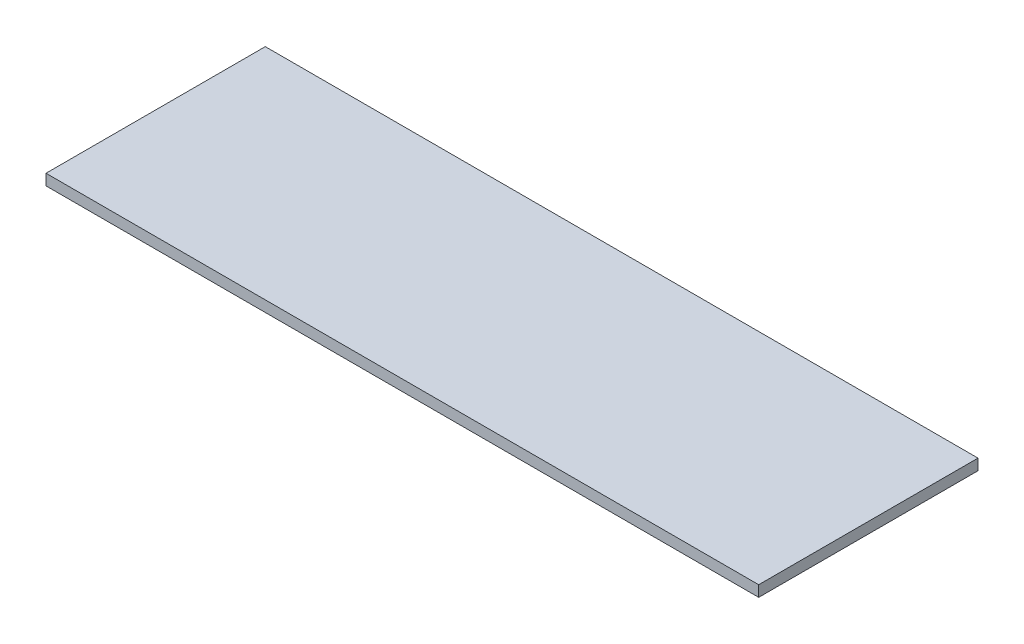
ISO-10303-21;
HEADER;
FILE_DESCRIPTION(('STEP AP214'),'2;1');
FILE_NAME('part.step','',(''),(''),'','','');
FILE_SCHEMA(('AUTOMOTIVE_DESIGN { 1 0 10303 214 1 1 1 1 }'));
ENDSEC;
DATA;
#1=APPLICATION_CONTEXT('core data for automotive mechanical design processes');
#2=APPLICATION_PROTOCOL_DEFINITION('international standard','automotive_design',2000,#1);
#3=PRODUCT_CONTEXT('',#1,'mechanical');
#4=PRODUCT('Part','Part','',(#3));
#5=PRODUCT_RELATED_PRODUCT_CATEGORY('part','',(#4));
#6=PRODUCT_DEFINITION_FORMATION('','',#4);
#7=PRODUCT_DEFINITION_CONTEXT('part definition',#1,'design');
#8=PRODUCT_DEFINITION('design','',#6,#7);
#9=PRODUCT_DEFINITION_SHAPE('','',#8);
#10=(LENGTH_UNIT() NAMED_UNIT(*) SI_UNIT(.MILLI.,.METRE.));
#11=(NAMED_UNIT(*) PLANE_ANGLE_UNIT() SI_UNIT($,.RADIAN.));
#12=(NAMED_UNIT(*) SI_UNIT($,.STERADIAN.) SOLID_ANGLE_UNIT());
#13=UNCERTAINTY_MEASURE_WITH_UNIT(LENGTH_MEASURE(1.E-05),#10,'distance_accuracy_value','');
#14=(GEOMETRIC_REPRESENTATION_CONTEXT(3) GLOBAL_UNCERTAINTY_ASSIGNED_CONTEXT((#13)) GLOBAL_UNIT_ASSIGNED_CONTEXT((#10,
#11,#12)) REPRESENTATION_CONTEXT('',''));
#15=CARTESIAN_POINT('',(0.,0.,0.));
#16=DIRECTION('',(0.,0.,1.));
#17=DIRECTION('',(1.,0.,0.));
#18=AXIS2_PLACEMENT_3D('',#15,#16,#17);
#19=CARTESIAN_POINT('',(585.,18.,-180.));
#20=DIRECTION('',(-1.,0.,0.));
#21=DIRECTION('',(0.,0.,1.));
#22=AXIS2_PLACEMENT_3D('',#19,#20,#21);
#23=PLANE('',#22);
#24=DIRECTION('',(0.,0.,-1.));
#25=VECTOR('',#24,1.);
#26=CARTESIAN_POINT('',(585.,0.,-180.));
#27=LINE('',#26,#25);
#28=CARTESIAN_POINT('',(585.,0.,180.));
#29=VERTEX_POINT('',#28);
#30=CARTESIAN_POINT('',(585.,0.,-180.));
#31=VERTEX_POINT('',#30);
#32=EDGE_CURVE('E96',#29,#31,#27,.T.);
#33=ORIENTED_EDGE('',*,*,#32,.T.);
#34=DIRECTION('',(0.,-1.,0.));
#35=VECTOR('',#34,1.);
#36=CARTESIAN_POINT('',(585.,18.,-180.));
#37=LINE('',#36,#35);
#38=CARTESIAN_POINT('',(585.,18.,-180.));
#39=VERTEX_POINT('',#38);
#40=EDGE_CURVE('E11',#39,#31,#37,.T.);
#41=ORIENTED_EDGE('',*,*,#40,.F.);
#42=DIRECTION('',(0.,0.,-1.));
#43=VECTOR('',#42,1.);
#44=CARTESIAN_POINT('',(585.,18.,-180.));
#45=LINE('',#44,#43);
#46=CARTESIAN_POINT('',(585.,18.,180.));
#47=VERTEX_POINT('',#46);
#48=EDGE_CURVE('E84',#47,#39,#45,.T.);
#49=ORIENTED_EDGE('',*,*,#48,.F.);
#50=DIRECTION('',(0.,-1.,0.));
#51=VECTOR('',#50,1.);
#52=CARTESIAN_POINT('',(585.,18.,180.));
#53=LINE('',#52,#51);
#54=EDGE_CURVE('E92',#47,#29,#53,.T.);
#55=ORIENTED_EDGE('',*,*,#54,.T.);
#56=EDGE_LOOP('',(#33,#41,#49,#55));
#57=FACE_BOUND('',#56,.T.);
#58=ADVANCED_FACE('F33',(#57),#23,.F.);
#59=CARTESIAN_POINT('',(-585.,18.,-180.));
#60=DIRECTION('',(0.,0.,1.));
#61=DIRECTION('',(1.,0.,0.));
#62=AXIS2_PLACEMENT_3D('',#59,#60,#61);
#63=PLANE('',#62);
#64=DIRECTION('',(-1.,0.,0.));
#65=VECTOR('',#64,1.);
#66=CARTESIAN_POINT('',(-585.,0.,-180.));
#67=LINE('',#66,#65);
#68=CARTESIAN_POINT('',(-585.,0.,-180.));
#69=VERTEX_POINT('',#68);
#70=EDGE_CURVE('E88',#31,#69,#67,.T.);
#71=ORIENTED_EDGE('',*,*,#70,.T.);
#72=DIRECTION('',(0.,-1.,0.));
#73=VECTOR('',#72,1.);
#74=CARTESIAN_POINT('',(-585.,18.,-180.));
#75=LINE('',#74,#73);
#76=CARTESIAN_POINT('',(-585.,18.,-180.));
#77=VERTEX_POINT('',#76);
#78=EDGE_CURVE('E41',#77,#69,#75,.T.);
#79=ORIENTED_EDGE('',*,*,#78,.F.);
#80=DIRECTION('',(-1.,0.,0.));
#81=VECTOR('',#80,1.);
#82=CARTESIAN_POINT('',(-585.,18.,-180.));
#83=LINE('',#82,#81);
#84=EDGE_CURVE('E79',#39,#77,#83,.T.);
#85=ORIENTED_EDGE('',*,*,#84,.F.);
#86=ORIENTED_EDGE('',*,*,#40,.T.);
#87=EDGE_LOOP('',(#71,#79,#85,#86));
#88=FACE_BOUND('',#87,.T.);
#89=ADVANCED_FACE('F87',(#88),#63,.F.);
#90=CARTESIAN_POINT('',(-585.,18.,-180.));
#91=DIRECTION('',(1.,0.,0.));
#92=DIRECTION('',(0.,0.,-1.));
#93=AXIS2_PLACEMENT_3D('',#90,#91,#92);
#94=PLANE('',#93);
#95=DIRECTION('',(0.,0.,1.));
#96=VECTOR('',#95,1.);
#97=CARTESIAN_POINT('',(-585.,0.,-180.));
#98=LINE('',#97,#96);
#99=CARTESIAN_POINT('',(-585.,0.,180.));
#100=VERTEX_POINT('',#99);
#101=EDGE_CURVE('E66',#69,#100,#98,.T.);
#102=ORIENTED_EDGE('',*,*,#101,.T.);
#103=DIRECTION('',(0.,-1.,0.));
#104=VECTOR('',#103,1.);
#105=CARTESIAN_POINT('',(-585.,18.,180.));
#106=LINE('',#105,#104);
#107=CARTESIAN_POINT('',(-585.,18.,180.));
#108=VERTEX_POINT('',#107);
#109=EDGE_CURVE('E89',#108,#100,#106,.T.);
#110=ORIENTED_EDGE('',*,*,#109,.F.);
#111=DIRECTION('',(0.,0.,1.));
#112=VECTOR('',#111,1.);
#113=CARTESIAN_POINT('',(-585.,18.,-180.));
#114=LINE('',#113,#112);
#115=EDGE_CURVE('E82',#77,#108,#114,.T.);
#116=ORIENTED_EDGE('',*,*,#115,.F.);
#117=ORIENTED_EDGE('',*,*,#78,.T.);
#118=EDGE_LOOP('',(#102,#110,#116,#117));
#119=FACE_BOUND('',#118,.T.);
#120=ADVANCED_FACE('F90',(#119),#94,.F.);
#121=CARTESIAN_POINT('',(-585.,18.,180.));
#122=DIRECTION('',(0.,0.,-1.));
#123=DIRECTION('',(-1.,0.,0.));
#124=AXIS2_PLACEMENT_3D('',#121,#122,#123);
#125=PLANE('',#124);
#126=DIRECTION('',(1.,0.,0.));
#127=VECTOR('',#126,1.);
#128=CARTESIAN_POINT('',(-585.,0.,180.));
#129=LINE('',#128,#127);
#130=EDGE_CURVE('E72',#100,#29,#129,.T.);
#131=ORIENTED_EDGE('',*,*,#130,.T.);
#132=ORIENTED_EDGE('',*,*,#54,.F.);
#133=DIRECTION('',(1.,0.,0.));
#134=VECTOR('',#133,1.);
#135=CARTESIAN_POINT('',(-585.,18.,180.));
#136=LINE('',#135,#134);
#137=EDGE_CURVE('E49',#108,#47,#136,.T.);
#138=ORIENTED_EDGE('',*,*,#137,.F.);
#139=ORIENTED_EDGE('',*,*,#109,.T.);
#140=EDGE_LOOP('',(#131,#132,#138,#139));
#141=FACE_BOUND('',#140,.T.);
#142=ADVANCED_FACE('F103',(#141),#125,.F.);
#143=CARTESIAN_POINT('',(0.,18.,0.));
#144=DIRECTION('',(0.,1.,0.));
#145=DIRECTION('',(0.,0.,1.));
#146=AXIS2_PLACEMENT_3D('',#143,#144,#145);
#147=PLANE('',#146);
#148=ORIENTED_EDGE('',*,*,#48,.T.);
#149=ORIENTED_EDGE('',*,*,#84,.T.);
#150=ORIENTED_EDGE('',*,*,#115,.T.);
#151=ORIENTED_EDGE('',*,*,#137,.T.);
#152=EDGE_LOOP('',(#148,#149,#150,#151));
#153=FACE_BOUND('',#152,.T.);
#154=ADVANCED_FACE('F80',(#153),#147,.T.);
#155=CARTESIAN_POINT('',(0.,0.,0.));
#156=DIRECTION('',(0.,1.,0.));
#157=DIRECTION('',(0.,0.,1.));
#158=AXIS2_PLACEMENT_3D('',#155,#156,#157);
#159=PLANE('',#158);
#160=ORIENTED_EDGE('',*,*,#32,.F.);
#161=ORIENTED_EDGE('',*,*,#130,.F.);
#162=ORIENTED_EDGE('',*,*,#101,.F.);
#163=ORIENTED_EDGE('',*,*,#70,.F.);
#164=EDGE_LOOP('',(#160,#161,#162,#163));
#165=FACE_BOUND('',#164,.T.);
#166=ADVANCED_FACE('F106',(#165),#159,.F.);
#167=CLOSED_SHELL('',(#58,#89,#120,#142,#154,#166));
#168=MANIFOLD_SOLID_BREP('B2',#167);
#169=ADVANCED_BREP_SHAPE_REPRESENTATION('',(#18,#168),#14);
#170=SHAPE_DEFINITION_REPRESENTATION(#9,#169);
ENDSEC;
END-ISO-10303-21;
